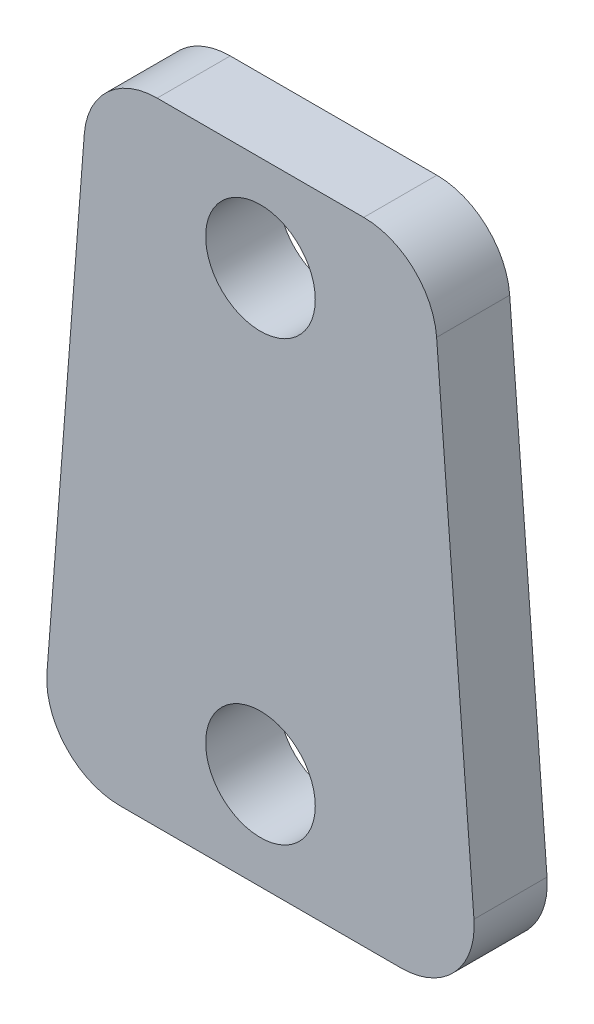
ISO-10303-21;
HEADER;
FILE_DESCRIPTION(('STEP AP214'),'2;1');
FILE_NAME('part.step','',(''),(''),'','','');
FILE_SCHEMA(('AUTOMOTIVE_DESIGN { 1 0 10303 214 1 1 1 1 }'));
ENDSEC;
DATA;
#1=APPLICATION_CONTEXT('core data for automotive mechanical design processes');
#2=APPLICATION_PROTOCOL_DEFINITION('international standard','automotive_design',2000,#1);
#3=PRODUCT_CONTEXT('',#1,'mechanical');
#4=PRODUCT('Part','Part','',(#3));
#5=PRODUCT_RELATED_PRODUCT_CATEGORY('part','',(#4));
#6=PRODUCT_DEFINITION_FORMATION('','',#4);
#7=PRODUCT_DEFINITION_CONTEXT('part definition',#1,'design');
#8=PRODUCT_DEFINITION('design','',#6,#7);
#9=PRODUCT_DEFINITION_SHAPE('','',#8);
#10=(LENGTH_UNIT() NAMED_UNIT(*) SI_UNIT(.MILLI.,.METRE.));
#11=(NAMED_UNIT(*) PLANE_ANGLE_UNIT() SI_UNIT($,.RADIAN.));
#12=(NAMED_UNIT(*) SI_UNIT($,.STERADIAN.) SOLID_ANGLE_UNIT());
#13=UNCERTAINTY_MEASURE_WITH_UNIT(LENGTH_MEASURE(1.E-05),#10,'distance_accuracy_value','');
#14=(GEOMETRIC_REPRESENTATION_CONTEXT(3) GLOBAL_UNCERTAINTY_ASSIGNED_CONTEXT((#13)) GLOBAL_UNIT_ASSIGNED_CONTEXT((#10,
#11,#12)) REPRESENTATION_CONTEXT('',''));
#15=CARTESIAN_POINT('',(0.,0.,0.));
#16=DIRECTION('',(0.,0.,1.));
#17=DIRECTION('',(1.,0.,0.));
#18=AXIS2_PLACEMENT_3D('',#15,#16,#17);
#19=CARTESIAN_POINT('',(0.,109.812666666667,3.175));
#20=DIRECTION('',(0.,1.,0.));
#21=DIRECTION('',(0.,0.,1.));
#22=AXIS2_PLACEMENT_3D('',#19,#20,#21);
#23=PLANE('',#22);
#24=DIRECTION('',(1.,0.,0.));
#25=VECTOR('',#24,1.);
#26=CARTESIAN_POINT('',(0.,109.812666666667,0.));
#27=LINE('',#26,#25);
#28=CARTESIAN_POINT('',(-4.48772292771507,109.812666666667,0.));
#29=VERTEX_POINT('',#28);
#30=CARTESIAN_POINT('',(4.48772292771512,109.812666666667,0.));
#31=VERTEX_POINT('',#30);
#32=EDGE_CURVE('E133',#29,#31,#27,.T.);
#33=ORIENTED_EDGE('',*,*,#32,.F.);
#34=DIRECTION('',(0.,0.,-1.));
#35=VECTOR('',#34,1.);
#36=CARTESIAN_POINT('',(-4.48772292771507,109.812666666667,3.175));
#37=LINE('',#36,#35);
#38=CARTESIAN_POINT('',(-4.48772292771507,109.812666666667,3.175));
#39=VERTEX_POINT('',#38);
#40=EDGE_CURVE('E11',#39,#29,#37,.T.);
#41=ORIENTED_EDGE('',*,*,#40,.F.);
#42=DIRECTION('',(1.,0.,0.));
#43=VECTOR('',#42,1.);
#44=CARTESIAN_POINT('',(0.,109.812666666667,3.175));
#45=LINE('',#44,#43);
#46=CARTESIAN_POINT('',(4.48772292771512,109.812666666667,3.175));
#47=VERTEX_POINT('',#46);
#48=EDGE_CURVE('E182',#39,#47,#45,.T.);
#49=ORIENTED_EDGE('',*,*,#48,.T.);
#50=DIRECTION('',(0.,0.,-1.));
#51=VECTOR('',#50,1.);
#52=CARTESIAN_POINT('',(4.48772292771512,109.812666666667,3.175));
#53=LINE('',#52,#51);
#54=EDGE_CURVE('E84',#47,#31,#53,.T.);
#55=ORIENTED_EDGE('',*,*,#54,.T.);
#56=EDGE_LOOP('',(#33,#41,#49,#55));
#57=FACE_BOUND('',#56,.T.);
#58=ADVANCED_FACE('F33',(#57),#23,.T.);
#59=CARTESIAN_POINT('',(-4.48772292771509,106.637666666667,3.175));
#60=DIRECTION('',(0.,0.,-1.));
#61=DIRECTION('',(-1.,0.,0.));
#62=AXIS2_PLACEMENT_3D('',#59,#60,#61);
#63=CYLINDRICAL_SURFACE('',#62,3.175);
#64=CARTESIAN_POINT('',(-4.48772292771509,106.637666666667,0.));
#65=DIRECTION('',(0.,0.,1.));
#66=DIRECTION('',(1.,0.,0.));
#67=AXIS2_PLACEMENT_3D('',#64,#65,#66);
#68=CIRCLE('',#67,3.175);
#69=CARTESIAN_POINT('',(-7.65337091918262,106.881178050626,0.));
#70=VERTEX_POINT('',#69);
#71=EDGE_CURVE('E136',#29,#70,#68,.T.);
#72=ORIENTED_EDGE('',*,*,#71,.T.);
#73=DIRECTION('',(0.,0.,-1.));
#74=VECTOR('',#73,1.);
#75=CARTESIAN_POINT('',(-7.65337091918262,106.881178050626,3.175));
#76=LINE('',#75,#74);
#77=CARTESIAN_POINT('',(-7.65337091918262,106.881178050626,3.175));
#78=VERTEX_POINT('',#77);
#79=EDGE_CURVE('E42',#78,#70,#76,.T.);
#80=ORIENTED_EDGE('',*,*,#79,.F.);
#81=CARTESIAN_POINT('',(-4.48772292771509,106.637666666667,3.175));
#82=DIRECTION('',(0.,0.,1.));
#83=DIRECTION('',(1.,0.,0.));
#84=AXIS2_PLACEMENT_3D('',#81,#82,#83);
#85=CIRCLE('',#84,3.175);
#86=EDGE_CURVE('E180',#39,#78,#85,.T.);
#87=ORIENTED_EDGE('',*,*,#86,.F.);
#88=ORIENTED_EDGE('',*,*,#40,.T.);
#89=EDGE_LOOP('',(#72,#80,#87,#88));
#90=FACE_BOUND('',#89,.T.);
#91=ADVANCED_FACE('F170',(#90),#63,.T.);
#92=CARTESIAN_POINT('',(-15.7816176470588,1.2139705882353,3.175));
#93=DIRECTION('',(-0.997054485501582,0.0766964988847372,0.));
#94=DIRECTION('',(-0.0766964988847372,-0.997054485501582,0.));
#95=AXIS2_PLACEMENT_3D('',#92,#93,#94);
#96=PLANE('',#95);
#97=DIRECTION('',(0.0766964988847372,0.997054485501582,0.));
#98=VECTOR('',#97,1.);
#99=CARTESIAN_POINT('',(-15.7816176470588,1.2139705882353,0.));
#100=LINE('',#99,#98);
#101=CARTESIAN_POINT('',(-9.27506322687493,85.7991780506257,0.));
#102=VERTEX_POINT('',#101);
#103=EDGE_CURVE('E139',#102,#70,#100,.T.);
#104=ORIENTED_EDGE('',*,*,#103,.F.);
#105=DIRECTION('',(0.,0.,-1.));
#106=VECTOR('',#105,1.);
#107=CARTESIAN_POINT('',(-9.27506322687493,85.7991780506257,3.175));
#108=LINE('',#107,#106);
#109=CARTESIAN_POINT('',(-9.27506322687493,85.7991780506257,3.175));
#110=VERTEX_POINT('',#109);
#111=EDGE_CURVE('E160',#110,#102,#108,.T.);
#112=ORIENTED_EDGE('',*,*,#111,.F.);
#113=DIRECTION('',(0.0766964988847372,0.997054485501582,0.));
#114=VECTOR('',#113,1.);
#115=CARTESIAN_POINT('',(-15.7816176470588,1.2139705882353,3.175));
#116=LINE('',#115,#114);
#117=EDGE_CURVE('E167',#110,#78,#116,.T.);
#118=ORIENTED_EDGE('',*,*,#117,.T.);
#119=ORIENTED_EDGE('',*,*,#79,.T.);
#120=EDGE_LOOP('',(#104,#112,#118,#119));
#121=FACE_BOUND('',#120,.T.);
#122=ADVANCED_FACE('F165',(#121),#96,.T.);
#123=CARTESIAN_POINT('',(-6.1094152354074,85.5556666666667,3.175));
#124=DIRECTION('',(0.,0.,-1.));
#125=DIRECTION('',(-1.,0.,0.));
#126=AXIS2_PLACEMENT_3D('',#123,#124,#125);
#127=CYLINDRICAL_SURFACE('',#126,3.175);
#128=CARTESIAN_POINT('',(-6.1094152354074,85.5556666666667,0.));
#129=DIRECTION('',(0.,0.,1.));
#130=DIRECTION('',(1.,0.,0.));
#131=AXIS2_PLACEMENT_3D('',#128,#129,#130);
#132=CIRCLE('',#131,3.175);
#133=CARTESIAN_POINT('',(-6.10941523540738,82.3806666666667,0.));
#134=VERTEX_POINT('',#133);
#135=EDGE_CURVE('E142',#102,#134,#132,.T.);
#136=ORIENTED_EDGE('',*,*,#135,.T.);
#137=DIRECTION('',(0.,0.,-1.));
#138=VECTOR('',#137,1.);
#139=CARTESIAN_POINT('',(-6.10941523540738,82.3806666666667,3.175));
#140=LINE('',#139,#138);
#141=CARTESIAN_POINT('',(-6.10941523540738,82.3806666666667,3.175));
#142=VERTEX_POINT('',#141);
#143=EDGE_CURVE('E157',#142,#134,#140,.T.);
#144=ORIENTED_EDGE('',*,*,#143,.F.);
#145=CARTESIAN_POINT('',(-6.1094152354074,85.5556666666667,3.175));
#146=DIRECTION('',(0.,0.,1.));
#147=DIRECTION('',(1.,0.,0.));
#148=AXIS2_PLACEMENT_3D('',#145,#146,#147);
#149=CIRCLE('',#148,3.175);
#150=EDGE_CURVE('E178',#110,#142,#149,.T.);
#151=ORIENTED_EDGE('',*,*,#150,.F.);
#152=ORIENTED_EDGE('',*,*,#111,.T.);
#153=EDGE_LOOP('',(#136,#144,#151,#152));
#154=FACE_BOUND('',#153,.T.);
#155=ADVANCED_FACE('F176',(#154),#127,.T.);
#156=CARTESIAN_POINT('',(0.,82.3806666666667,3.175));
#157=DIRECTION('',(0.,1.,0.));
#158=DIRECTION('',(-1.,0.,0.));
#159=AXIS2_PLACEMENT_3D('',#156,#157,#158);
#160=PLANE('',#159);
#161=DIRECTION('',(1.,0.,0.));
#162=VECTOR('',#161,1.);
#163=CARTESIAN_POINT('',(0.,82.3806666666667,0.));
#164=LINE('',#163,#162);
#165=CARTESIAN_POINT('',(6.10941523540742,82.3806666666667,0.));
#166=VERTEX_POINT('',#165);
#167=EDGE_CURVE('E145',#134,#166,#164,.T.);
#168=ORIENTED_EDGE('',*,*,#167,.T.);
#169=DIRECTION('',(0.,0.,-1.));
#170=VECTOR('',#169,1.);
#171=CARTESIAN_POINT('',(6.10941523540742,82.3806666666667,3.175));
#172=LINE('',#171,#170);
#173=CARTESIAN_POINT('',(6.10941523540742,82.3806666666667,3.175));
#174=VERTEX_POINT('',#173);
#175=EDGE_CURVE('E114',#174,#166,#172,.T.);
#176=ORIENTED_EDGE('',*,*,#175,.F.);
#177=DIRECTION('',(1.,0.,0.));
#178=VECTOR('',#177,1.);
#179=CARTESIAN_POINT('',(0.,82.3806666666667,3.175));
#180=LINE('',#179,#178);
#181=EDGE_CURVE('E119',#142,#174,#180,.T.);
#182=ORIENTED_EDGE('',*,*,#181,.F.);
#183=ORIENTED_EDGE('',*,*,#143,.T.);
#184=EDGE_LOOP('',(#168,#176,#182,#183));
#185=FACE_BOUND('',#184,.T.);
#186=ADVANCED_FACE('F222',(#185),#160,.F.);
#187=CARTESIAN_POINT('',(6.10941523540744,85.5556666666667,3.175));
#188=DIRECTION('',(0.,0.,-1.));
#189=DIRECTION('',(-1.,0.,0.));
#190=AXIS2_PLACEMENT_3D('',#187,#188,#189);
#191=CYLINDRICAL_SURFACE('',#190,3.175);
#192=CARTESIAN_POINT('',(6.10941523540744,85.5556666666667,0.));
#193=DIRECTION('',(0.,0.,1.));
#194=DIRECTION('',(1.,0.,0.));
#195=AXIS2_PLACEMENT_3D('',#192,#193,#194);
#196=CIRCLE('',#195,3.175);
#197=CARTESIAN_POINT('',(9.27506322687496,85.7991780506257,0.));
#198=VERTEX_POINT('',#197);
#199=EDGE_CURVE('E109',#198,#166,#196,.F.);
#200=ORIENTED_EDGE('',*,*,#199,.F.);
#201=DIRECTION('',(0.,0.,-1.));
#202=VECTOR('',#201,1.);
#203=CARTESIAN_POINT('',(9.27506322687496,85.7991780506257,3.175));
#204=LINE('',#203,#202);
#205=CARTESIAN_POINT('',(9.27506322687496,85.7991780506257,3.175));
#206=VERTEX_POINT('',#205);
#207=EDGE_CURVE('E104',#206,#198,#204,.T.);
#208=ORIENTED_EDGE('',*,*,#207,.F.);
#209=CARTESIAN_POINT('',(6.10941523540744,85.5556666666667,3.175));
#210=DIRECTION('',(0.,0.,1.));
#211=DIRECTION('',(1.,0.,0.));
#212=AXIS2_PLACEMENT_3D('',#209,#210,#211);
#213=CIRCLE('',#212,3.175);
#214=EDGE_CURVE('E107',#206,#174,#213,.F.);
#215=ORIENTED_EDGE('',*,*,#214,.T.);
#216=ORIENTED_EDGE('',*,*,#175,.T.);
#217=EDGE_LOOP('',(#200,#208,#215,#216));
#218=FACE_BOUND('',#217,.T.);
#219=ADVANCED_FACE('F106',(#218),#191,.T.);
#220=CARTESIAN_POINT('',(15.7816176470588,1.21397058823529,3.175));
#221=DIRECTION('',(0.997054485501582,0.0766964988847366,0.));
#222=DIRECTION('',(-0.0766964988847366,0.997054485501582,0.));
#223=AXIS2_PLACEMENT_3D('',#220,#221,#222);
#224=PLANE('',#223);
#225=DIRECTION('',(0.0766964988847366,-0.997054485501582,0.));
#226=VECTOR('',#225,1.);
#227=CARTESIAN_POINT('',(15.7816176470588,1.21397058823529,0.));
#228=LINE('',#227,#226);
#229=CARTESIAN_POINT('',(7.65337091918267,106.881178050626,0.));
#230=VERTEX_POINT('',#229);
#231=EDGE_CURVE('E149',#230,#198,#228,.T.);
#232=ORIENTED_EDGE('',*,*,#231,.F.);
#233=DIRECTION('',(0.,0.,-1.));
#234=VECTOR('',#233,1.);
#235=CARTESIAN_POINT('',(7.65337091918267,106.881178050626,3.175));
#236=LINE('',#235,#234);
#237=CARTESIAN_POINT('',(7.65337091918267,106.881178050626,3.175));
#238=VERTEX_POINT('',#237);
#239=EDGE_CURVE('E77',#238,#230,#236,.T.);
#240=ORIENTED_EDGE('',*,*,#239,.F.);
#241=DIRECTION('',(0.0766964988847366,-0.997054485501582,0.));
#242=VECTOR('',#241,1.);
#243=CARTESIAN_POINT('',(15.7816176470588,1.21397058823529,3.175));
#244=LINE('',#243,#242);
#245=EDGE_CURVE('E117',#238,#206,#244,.T.);
#246=ORIENTED_EDGE('',*,*,#245,.T.);
#247=ORIENTED_EDGE('',*,*,#207,.T.);
#248=EDGE_LOOP('',(#232,#240,#246,#247));
#249=FACE_BOUND('',#248,.T.);
#250=ADVANCED_FACE('F122',(#249),#224,.T.);
#251=CARTESIAN_POINT('',(0.,105.664000084667,3.175));
#252=DIRECTION('',(0.,0.,-1.));
#253=DIRECTION('',(-1.,0.,0.));
#254=AXIS2_PLACEMENT_3D('',#251,#252,#253);
#255=CYLINDRICAL_SURFACE('',#254,2.38125);
#256=CARTESIAN_POINT('',(0.,105.664000084667,3.175));
#257=DIRECTION('',(0.,0.,1.));
#258=DIRECTION('',(1.,0.,0.));
#259=AXIS2_PLACEMENT_3D('',#256,#257,#258);
#260=CIRCLE('',#259,2.38125);
#261=CARTESIAN_POINT('',(2.38125,105.664000084667,3.175));
#262=VERTEX_POINT('',#261);
#263=EDGE_CURVE('E186',#262,#262,#260,.T.);
#264=ORIENTED_EDGE('',*,*,#263,.T.);
#265=EDGE_LOOP('',(#264));
#266=FACE_BOUND('',#265,.T.);
#267=CARTESIAN_POINT('',(0.,105.664000084667,0.));
#268=DIRECTION('',(0.,0.,1.));
#269=DIRECTION('',(1.,0.,0.));
#270=AXIS2_PLACEMENT_3D('',#267,#268,#269);
#271=CIRCLE('',#270,2.38125);
#272=CARTESIAN_POINT('',(2.38125,105.664000084667,0.));
#273=VERTEX_POINT('',#272);
#274=EDGE_CURVE('E130',#273,#273,#271,.T.);
#275=ORIENTED_EDGE('',*,*,#274,.F.);
#276=EDGE_LOOP('',(#275));
#277=FACE_BOUND('',#276,.T.);
#278=ADVANCED_FACE('F200',(#266,#277),#255,.F.);
#279=CARTESIAN_POINT('',(0.,86.6140000846667,3.175));
#280=DIRECTION('',(0.,0.,-1.));
#281=DIRECTION('',(-1.,0.,0.));
#282=AXIS2_PLACEMENT_3D('',#279,#280,#281);
#283=CYLINDRICAL_SURFACE('',#282,2.38125);
#284=CARTESIAN_POINT('',(0.,86.6140000846667,3.175));
#285=DIRECTION('',(0.,0.,1.));
#286=DIRECTION('',(1.,0.,0.));
#287=AXIS2_PLACEMENT_3D('',#284,#285,#286);
#288=CIRCLE('',#287,2.38125);
#289=CARTESIAN_POINT('',(2.38125,86.6140000846667,3.175));
#290=VERTEX_POINT('',#289);
#291=EDGE_CURVE('E153',#290,#290,#288,.T.);
#292=ORIENTED_EDGE('',*,*,#291,.T.);
#293=EDGE_LOOP('',(#292));
#294=FACE_BOUND('',#293,.T.);
#295=CARTESIAN_POINT('',(0.,86.6140000846667,0.));
#296=DIRECTION('',(0.,0.,1.));
#297=DIRECTION('',(1.,0.,0.));
#298=AXIS2_PLACEMENT_3D('',#295,#296,#297);
#299=CIRCLE('',#298,2.38125);
#300=CARTESIAN_POINT('',(2.38125,86.6140000846667,0.));
#301=VERTEX_POINT('',#300);
#302=EDGE_CURVE('E127',#301,#301,#299,.T.);
#303=ORIENTED_EDGE('',*,*,#302,.F.);
#304=EDGE_LOOP('',(#303));
#305=FACE_BOUND('',#304,.T.);
#306=ADVANCED_FACE('F35',(#294,#305),#283,.F.);
#307=CARTESIAN_POINT('',(4.48772292771514,106.637666666667,3.175));
#308=DIRECTION('',(0.,0.,-1.));
#309=DIRECTION('',(-1.,0.,0.));
#310=AXIS2_PLACEMENT_3D('',#307,#308,#309);
#311=CYLINDRICAL_SURFACE('',#310,3.175);
#312=CARTESIAN_POINT('',(4.48772292771514,106.637666666667,0.));
#313=DIRECTION('',(0.,0.,1.));
#314=DIRECTION('',(1.,0.,0.));
#315=AXIS2_PLACEMENT_3D('',#312,#313,#314);
#316=CIRCLE('',#315,3.175);
#317=EDGE_CURVE('E151',#230,#31,#316,.T.);
#318=ORIENTED_EDGE('',*,*,#317,.T.);
#319=ORIENTED_EDGE('',*,*,#54,.F.);
#320=CARTESIAN_POINT('',(4.48772292771514,106.637666666667,3.175));
#321=DIRECTION('',(0.,0.,1.));
#322=DIRECTION('',(1.,0.,0.));
#323=AXIS2_PLACEMENT_3D('',#320,#321,#322);
#324=CIRCLE('',#323,3.175);
#325=EDGE_CURVE('E50',#238,#47,#324,.T.);
#326=ORIENTED_EDGE('',*,*,#325,.F.);
#327=ORIENTED_EDGE('',*,*,#239,.T.);
#328=EDGE_LOOP('',(#318,#319,#326,#327));
#329=FACE_BOUND('',#328,.T.);
#330=ADVANCED_FACE('F196',(#329),#311,.T.);
#331=CARTESIAN_POINT('',(0.,0.,3.175));
#332=DIRECTION('',(0.,0.,1.));
#333=DIRECTION('',(1.,0.,0.));
#334=AXIS2_PLACEMENT_3D('',#331,#332,#333);
#335=PLANE('',#334);
#336=ORIENTED_EDGE('',*,*,#291,.F.);
#337=EDGE_LOOP('',(#336));
#338=FACE_BOUND('',#337,.T.);
#339=ORIENTED_EDGE('',*,*,#263,.F.);
#340=EDGE_LOOP('',(#339));
#341=FACE_BOUND('',#340,.T.);
#342=ORIENTED_EDGE('',*,*,#48,.F.);
#343=ORIENTED_EDGE('',*,*,#86,.T.);
#344=ORIENTED_EDGE('',*,*,#117,.F.);
#345=ORIENTED_EDGE('',*,*,#150,.T.);
#346=ORIENTED_EDGE('',*,*,#181,.T.);
#347=ORIENTED_EDGE('',*,*,#214,.F.);
#348=ORIENTED_EDGE('',*,*,#245,.F.);
#349=ORIENTED_EDGE('',*,*,#325,.T.);
#350=EDGE_LOOP('',(#342,#343,#344,#345,#346,#347,#348,#349));
#351=FACE_BOUND('',#350,.T.);
#352=ADVANCED_FACE('F116',(#338,#341,#351),#335,.T.);
#353=CARTESIAN_POINT('',(0.,0.,0.));
#354=DIRECTION('',(0.,0.,1.));
#355=DIRECTION('',(1.,0.,0.));
#356=AXIS2_PLACEMENT_3D('',#353,#354,#355);
#357=PLANE('',#356);
#358=ORIENTED_EDGE('',*,*,#302,.T.);
#359=EDGE_LOOP('',(#358));
#360=FACE_BOUND('',#359,.T.);
#361=ORIENTED_EDGE('',*,*,#274,.T.);
#362=EDGE_LOOP('',(#361));
#363=FACE_BOUND('',#362,.T.);
#364=ORIENTED_EDGE('',*,*,#32,.T.);
#365=ORIENTED_EDGE('',*,*,#317,.F.);
#366=ORIENTED_EDGE('',*,*,#231,.T.);
#367=ORIENTED_EDGE('',*,*,#199,.T.);
#368=ORIENTED_EDGE('',*,*,#167,.F.);
#369=ORIENTED_EDGE('',*,*,#135,.F.);
#370=ORIENTED_EDGE('',*,*,#103,.T.);
#371=ORIENTED_EDGE('',*,*,#71,.F.);
#372=EDGE_LOOP('',(#364,#365,#366,#367,#368,#369,#370,#371));
#373=FACE_BOUND('',#372,.T.);
#374=ADVANCED_FACE('F173',(#360,#363,#373),#357,.F.);
#375=CLOSED_SHELL('',(#58,#91,#122,#155,#186,#219,#250,#278,#306,#330,#352,#374));
#376=MANIFOLD_SOLID_BREP('B2',#375);
#377=ADVANCED_BREP_SHAPE_REPRESENTATION('',(#18,#376),#14);
#378=SHAPE_DEFINITION_REPRESENTATION(#9,#377);
ENDSEC;
END-ISO-10303-21;
